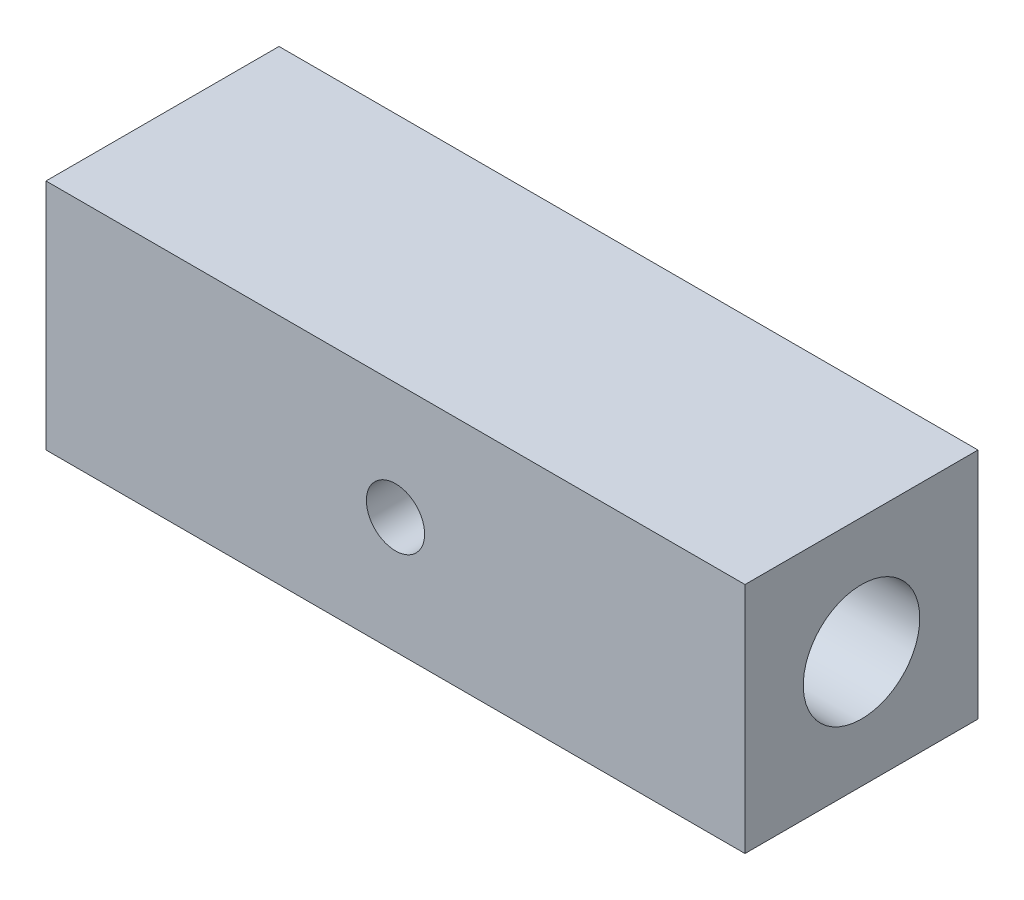
ISO-10303-21;
HEADER;
FILE_DESCRIPTION(('STEP AP214'),'2;1');
FILE_NAME('part.step','',(''),(''),'','','');
FILE_SCHEMA(('AUTOMOTIVE_DESIGN { 1 0 10303 214 1 1 1 1 }'));
ENDSEC;
DATA;
#1=APPLICATION_CONTEXT('core data for automotive mechanical design processes');
#2=APPLICATION_PROTOCOL_DEFINITION('international standard','automotive_design',2000,#1);
#3=PRODUCT_CONTEXT('',#1,'mechanical');
#4=PRODUCT('Part','Part','',(#3));
#5=PRODUCT_RELATED_PRODUCT_CATEGORY('part','',(#4));
#6=PRODUCT_DEFINITION_FORMATION('','',#4);
#7=PRODUCT_DEFINITION_CONTEXT('part definition',#1,'design');
#8=PRODUCT_DEFINITION('design','',#6,#7);
#9=PRODUCT_DEFINITION_SHAPE('','',#8);
#10=(LENGTH_UNIT() NAMED_UNIT(*) SI_UNIT(.MILLI.,.METRE.));
#11=(NAMED_UNIT(*) PLANE_ANGLE_UNIT() SI_UNIT($,.RADIAN.));
#12=(NAMED_UNIT(*) SI_UNIT($,.STERADIAN.) SOLID_ANGLE_UNIT());
#13=UNCERTAINTY_MEASURE_WITH_UNIT(LENGTH_MEASURE(1.E-05),#10,'distance_accuracy_value','');
#14=(GEOMETRIC_REPRESENTATION_CONTEXT(3) GLOBAL_UNCERTAINTY_ASSIGNED_CONTEXT((#13)) GLOBAL_UNIT_ASSIGNED_CONTEXT((#10,
#11,#12)) REPRESENTATION_CONTEXT('',''));
#15=CARTESIAN_POINT('',(0.,0.,0.));
#16=DIRECTION('',(0.,0.,1.));
#17=DIRECTION('',(1.,0.,0.));
#18=AXIS2_PLACEMENT_3D('',#15,#16,#17);
#19=CARTESIAN_POINT('',(-38.1000002396493,12.7000000000205,25.4634999977869));
#20=DIRECTION('',(0.,0.,-1.));
#21=DIRECTION('',(-1.,0.,0.));
#22=AXIS2_PLACEMENT_3D('',#19,#20,#21);
#23=CYLINDRICAL_SURFACE('',#22,3.190875);
#24=CARTESIAN_POINT('',(-41.2908752396493,12.7000000000205,19.0817499977869));
#25=CARTESIAN_POINT('',(-41.2908743474931,12.6160855933507,19.0817493060097));
#26=CARTESIAN_POINT('',(-41.2875588658311,12.5321623311625,19.0800893248495));
#27=CARTESIAN_POINT('',(-41.2743471357267,12.3649547781104,19.0735000112951));
#28=CARTESIAN_POINT('',(-41.2644480244409,12.2816707811699,19.0685692566314));
#29=CARTESIAN_POINT('',(-41.2249753142781,12.0335020592202,19.0490113866076));
#30=CARTESIAN_POINT('',(-41.1856265368609,11.8704226025251,19.0296189121461));
#31=CARTESIAN_POINT('',(-41.0828495747987,11.5546504545712,18.9801628203011));
#32=CARTESIAN_POINT('',(-41.0195149693097,11.4019200828612,18.9501407030445));
#33=CARTESIAN_POINT('',(-40.8710504856523,11.1094464478898,18.8821852588054));
#34=CARTESIAN_POINT('',(-40.7859223259476,10.9697021618341,18.8442525556315));
#35=CARTESIAN_POINT('',(-40.5904207617664,10.6976972060963,18.7612665144259));
#36=CARTESIAN_POINT('',(-40.4788316439664,10.5664007393246,18.7159212268586));
#37=CARTESIAN_POINT('',(-40.2362315726586,10.3235059558684,18.624178880477));
#38=CARTESIAN_POINT('',(-40.105205957734,10.2119226497272,18.5777810502808));
#39=CARTESIAN_POINT('',(-39.8151121871572,10.0028930726167,18.4850175288783));
#40=CARTESIAN_POINT('',(-39.6546573206912,9.90721419164304,18.4389333668636));
#41=CARTESIAN_POINT('',(-39.401929512539,9.78530553300755,18.3774435786149));
#42=CARTESIAN_POINT('',(-39.3156481775115,9.74826207554571,18.3582145268865));
#43=CARTESIAN_POINT('',(-39.1395866978743,9.68175878718743,18.3230212765622));
#44=CARTESIAN_POINT('',(-39.0498086564779,9.65229447625028,18.3070551504004));
#45=CARTESIAN_POINT('',(-38.8728346349247,9.602848653926,18.2798867447191));
#46=CARTESIAN_POINT('',(-38.7858013916506,9.58240831249509,18.2684580606213));
#47=CARTESIAN_POINT('',(-38.6099500242599,9.54886671639478,18.2495462293957));
#48=CARTESIAN_POINT('',(-38.5211328731087,9.53576156788603,18.2420609890408));
#49=CARTESIAN_POINT('',(-38.3424999671064,9.5170874838334,18.2313579494052));
#50=CARTESIAN_POINT('',(-38.252684846572,9.51151400964399,18.2281375801035));
#51=CARTESIAN_POINT('',(-38.0728845515503,9.50797147301019,18.2260908711929));
#52=CARTESIAN_POINT('',(-37.9828993941066,9.51000168503876,18.2272641123555));
#53=CARTESIAN_POINT('',(-37.7354386245463,9.52609010020135,18.2365368609324));
#54=CARTESIAN_POINT('',(-37.5785643011869,9.54810640281817,18.2492166142319));
#55=CARTESIAN_POINT('',(-37.2712303651362,9.61461234898019,18.2864582529678));
#56=CARTESIAN_POINT('',(-37.1207728123814,9.6591091512827,18.3110239232856));
#57=CARTESIAN_POINT('',(-36.8261182216023,9.77010832619232,18.3697867461296));
#58=CARTESIAN_POINT('',(-36.682148641663,9.83709913081982,18.404194915742));
#59=CARTESIAN_POINT('',(-36.4068103230444,9.99081384668363,18.4787828493036));
#60=CARTESIAN_POINT('',(-36.2754472821428,10.0775466215404,18.5189652027113));
#61=CARTESIAN_POINT('',(-36.0115054440278,10.2811060593123,18.606729602424));
#62=CARTESIAN_POINT('',(-35.8808844778685,10.4003540922512,18.6546038767465));
#63=CARTESIAN_POINT('',(-35.6406796710711,10.6592580706138,18.7482276885647));
#64=CARTESIAN_POINT('',(-35.5311058843588,10.7989237134068,18.7939762027454));
#65=CARTESIAN_POINT('',(-35.331323810331,11.102914400797,18.8807882942936));
#66=CARTESIAN_POINT('',(-35.2422510966415,11.2680833851143,18.9215356612814));
#67=CARTESIAN_POINT('',(-35.0938863676058,11.6136148629854,18.9910615344014));
#68=CARTESIAN_POINT('',(-35.0345707053119,11.7939651589212,19.0198495411053));
#69=CARTESIAN_POINT('',(-34.9522805392333,12.1487237213405,19.060190332675));
#70=CARTESIAN_POINT('',(-34.926703018699,12.3223869688383,19.072973122973));
#71=CARTESIAN_POINT('',(-34.9044514647777,12.6719853939259,19.084079765836));
#72=CARTESIAN_POINT('',(-34.9077637388743,12.8479194557708,19.08241046807));
#73=CARTESIAN_POINT('',(-34.9416935067744,13.1825655095312,19.0655145786413));
#74=CARTESIAN_POINT('',(-34.9701747600815,13.3415554386875,19.0513487986442));
#75=CARTESIAN_POINT('',(-35.0502833972502,13.6521790924887,19.0122582067243));
#76=CARTESIAN_POINT('',(-35.101913332869,13.8038120041022,18.9873322086777));
#77=CARTESIAN_POINT('',(-35.2282078462418,14.1004386885047,18.9280854800621));
#78=CARTESIAN_POINT('',(-35.3034888316811,14.2451186680511,18.8935165088746));
#79=CARTESIAN_POINT('',(-35.4742532474636,14.5202708975479,18.8183105383668));
#80=CARTESIAN_POINT('',(-35.5697452839216,14.6507370591177,18.7776709562814));
#81=CARTESIAN_POINT('',(-35.7890422867749,14.9073442255144,18.6895347050218));
#82=CARTESIAN_POINT('',(-35.9147067397964,15.0318023535744,18.6417565682604));
#83=CARTESIAN_POINT('',(-36.1852364065748,15.2586232883051,18.5476738347622));
#84=CARTESIAN_POINT('',(-36.3301147917921,15.3609708101197,18.5013702761206));
#85=CARTESIAN_POINT('',(-36.6438241846174,15.5453284919315,18.4132997274388));
#86=CARTESIAN_POINT('',(-36.8134753880072,15.6261137297505,18.3718610262772));
#87=CARTESIAN_POINT('',(-37.1667014268634,15.7571225364075,18.302349177137));
#88=CARTESIAN_POINT('',(-37.3502579764859,15.8073854842173,18.2742588177406));
#89=CARTESIAN_POINT('',(-37.7072361459018,15.8712884147015,18.2381305432187));
#90=CARTESIAN_POINT('',(-37.8799391588086,15.8879808744831,18.2284265308365));
#91=CARTESIAN_POINT('',(-38.225870904357,15.8930739959374,18.2254900092978));
#92=CARTESIAN_POINT('',(-38.3990993765997,15.8814869208427,18.2322503604765));
#93=CARTESIAN_POINT('',(-38.7237636432386,15.8332035581607,18.2597123731386));
#94=CARTESIAN_POINT('',(-38.8757034010891,15.7990044446577,18.2790245697034));
#95=CARTESIAN_POINT('',(-39.1715220239673,15.70955455655,18.3277786797279));
#96=CARTESIAN_POINT('',(-39.3153982789139,15.6542970101558,18.3572238513666));
#97=CARTESIAN_POINT('',(-39.601705107575,15.5201460214552,18.4253400399755));
#98=CARTESIAN_POINT('',(-39.7433891130618,15.439914018085,18.4644979870663));
#99=CARTESIAN_POINT('',(-40.012211158531,15.2595617295441,18.5468106789648));
#100=CARTESIAN_POINT('',(-40.1393415763917,15.1594310973283,18.5899674968792));
#101=CARTESIAN_POINT('',(-40.3914982514472,14.9278868910157,18.681687173087));
#102=CARTESIAN_POINT('',(-40.5143918948442,14.7941505450355,18.7302697385542));
#103=CARTESIAN_POINT('',(-40.7365151022486,14.5065002145292,18.8225840708332));
#104=CARTESIAN_POINT('',(-40.8357319109619,14.3525754228676,18.8663132162335));
#105=CARTESIAN_POINT('',(-40.9645319071774,14.1087960928506,18.9248802833488));
#106=CARTESIAN_POINT('',(-41.0042498262491,14.0250141103312,18.9432928891643));
#107=CARTESIAN_POINT('',(-41.0764077118471,13.8538173952883,18.9771834007167));
#108=CARTESIAN_POINT('',(-41.1088512542163,13.7664044727728,18.9926627477646));
#109=CARTESIAN_POINT('',(-41.1660133822939,13.5887831294476,19.0201947237623));
#110=CARTESIAN_POINT('',(-41.1907488163781,13.4985812862159,19.0322548212222));
#111=CARTESIAN_POINT('',(-41.2322509661268,13.31599028992,19.0526148826845));
#112=CARTESIAN_POINT('',(-41.2490225495038,13.2236025093092,19.0609171434289));
#113=CARTESIAN_POINT('',(-41.271394605936,13.0593190042825,19.0720266555834));
#114=CARTESIAN_POINT('',(-41.2786934550052,12.9877054167415,19.0756664394564));
#115=CARTESIAN_POINT('',(-41.2884342218196,12.8440634023065,19.0805284408449));
#116=CARTESIAN_POINT('',(-41.2908760055064,12.7720349640174,19.0817505916319));
#117=CARTESIAN_POINT('',(-41.2908752396493,12.7000000000205,19.0817499977869));
#118=B_SPLINE_CURVE_WITH_KNOTS('',3,(#24,#25,#26,#27,#28,#29,#30,#31,#32,#33,#34,#35,#36,#37,
#38,#39,#40,#41,#42,#43,#44,#45,#46,#47,#48,#49,#50,#51,#52,#53,#54,#55,#56,#57,#58,#59,#60,#61,
#62,#63,#64,#65,#66,#67,#68,#69,#70,#71,#72,#73,#74,#75,#76,#77,#78,#79,#80,#81,#82,#83,#84,#85,
#86,#87,#88,#89,#90,#91,#92,#93,#94,#95,#96,#97,#98,#99,#100,#101,#102,#103,#104,#105,#106,#107,
#108,#109,#110,#111,#112,#113,#114,#115,#116,#117),.UNSPECIFIED.,.T.,.F.,(4,2,2,2,2,2,2,2,2,2,2,
2,2,2,2,2,2,2,2,2,2,2,2,2,2,2,2,2,2,2,2,2,2,2,2,2,2,2,2,2,2,2,2,2,2,2,4),(0.,0.251667690163192,
0.503444887798333,1.00736028760569,1.50932961580885,2.01125937494807,2.54355475475194,
3.07625371897668,3.65026349864964,3.93746226456018,4.22449087486513,4.49449336842552,
4.76435239665599,5.03404873311156,5.30371933639088,5.77802232661177,6.2524764505813,
6.73798200179402,7.2237059635799,7.7710182476052,8.31859132794363,8.89159231090284,
9.4641372247175,9.98926187064536,10.5141376436734,10.998331928795,11.4825796014088,
11.980673095598,12.4789791123839,13.0262192769592,13.5738365415424,14.1479736652377,
14.7213684713491,15.2397195915976,15.7578459722668,16.2266132826379,16.695531462535,
17.1959540910977,17.6966376174516,18.2581576406254,18.8199794889938,19.1032427163757,
19.3863663941547,19.6688668078388,19.9511943269528,20.1672284189608,20.3832684735777),.UNSPECIFIED.);
#119=CARTESIAN_POINT('',(-41.2908752396493,12.7000000000205,19.0817499977869));
#120=VERTEX_POINT('',#119);
#121=EDGE_CURVE('E39',#120,#120,#118,.T.);
#122=ORIENTED_EDGE('',*,*,#121,.F.);
#123=EDGE_LOOP('',(#122));
#124=FACE_BOUND('',#123,.T.);
#125=CARTESIAN_POINT('',(-38.1000002396493,12.7000000000205,25.4634999977869));
#126=DIRECTION('',(0.,0.,1.));
#127=DIRECTION('',(1.,0.,0.));
#128=AXIS2_PLACEMENT_3D('',#125,#126,#127);
#129=CIRCLE('',#128,3.190875);
#130=CARTESIAN_POINT('',(-34.9091252396493,12.7000000000205,25.4634999977869));
#131=VERTEX_POINT('',#130);
#132=EDGE_CURVE('E110',#131,#131,#129,.T.);
#133=ORIENTED_EDGE('',*,*,#132,.T.);
#134=EDGE_LOOP('',(#133));
#135=FACE_BOUND('',#134,.T.);
#136=ADVANCED_FACE('F35',(#124,#135),#23,.F.);
#137=CARTESIAN_POINT('',(0.190499760350716,-0.0634999999795309,25.4634999977869));
#138=DIRECTION('',(0.,0.,1.));
#139=DIRECTION('',(1.,0.,0.));
#140=AXIS2_PLACEMENT_3D('',#137,#138,#139);
#141=PLANE('',#140);
#142=DIRECTION('',(0.,-1.,0.));
#143=VECTOR('',#142,1.);
#144=CARTESIAN_POINT('',(-76.3905002396493,25.4635000000205,25.4634999977869));
#145=LINE('',#144,#143);
#146=CARTESIAN_POINT('',(-76.3905002396493,25.4635000000205,25.4634999977869));
#147=VERTEX_POINT('',#146);
#148=CARTESIAN_POINT('',(-76.3905002396493,-0.0634999999795309,25.4634999977869));
#149=VERTEX_POINT('',#148);
#150=EDGE_CURVE('E94',#147,#149,#145,.T.);
#151=ORIENTED_EDGE('',*,*,#150,.T.);
#152=DIRECTION('',(1.,0.,0.));
#153=VECTOR('',#152,1.);
#154=CARTESIAN_POINT('',(-76.3905002396493,-0.0634999999795309,25.4634999977869));
#155=LINE('',#154,#153);
#156=CARTESIAN_POINT('',(0.190499760350716,-0.0634999999795309,25.4634999977869));
#157=VERTEX_POINT('',#156);
#158=EDGE_CURVE('E88',#149,#157,#155,.T.);
#159=ORIENTED_EDGE('',*,*,#158,.T.);
#160=DIRECTION('',(0.,1.,0.));
#161=VECTOR('',#160,1.);
#162=CARTESIAN_POINT('',(0.190499760350716,25.4635000000205,25.4634999977869));
#163=LINE('',#162,#161);
#164=CARTESIAN_POINT('',(0.190499760350716,25.4635000000205,25.4634999977869));
#165=VERTEX_POINT('',#164);
#166=EDGE_CURVE('E92',#157,#165,#163,.T.);
#167=ORIENTED_EDGE('',*,*,#166,.T.);
#168=DIRECTION('',(-1.,0.,0.));
#169=VECTOR('',#168,1.);
#170=CARTESIAN_POINT('',(-76.3905002396493,25.4635000000205,25.4634999977869));
#171=LINE('',#170,#169);
#172=EDGE_CURVE('E58',#165,#147,#171,.T.);
#173=ORIENTED_EDGE('',*,*,#172,.T.);
#174=EDGE_LOOP('',(#151,#159,#167,#173));
#175=FACE_BOUND('',#174,.T.);
#176=ORIENTED_EDGE('',*,*,#132,.F.);
#177=EDGE_LOOP('',(#176));
#178=FACE_BOUND('',#177,.T.);
#179=ADVANCED_FACE('F89',(#175,#178),#141,.T.);
#180=CARTESIAN_POINT('',(0.190499760350716,-0.0634999999795309,-0.0635000022130899));
#181=DIRECTION('',(0.,0.,1.));
#182=DIRECTION('',(1.,0.,0.));
#183=AXIS2_PLACEMENT_3D('',#180,#181,#182);
#184=PLANE('',#183);
#185=DIRECTION('',(0.,-1.,0.));
#186=VECTOR('',#185,1.);
#187=CARTESIAN_POINT('',(-76.3905002396493,25.4635000000205,-0.0635000022130899));
#188=LINE('',#187,#186);
#189=CARTESIAN_POINT('',(-76.3905002396493,25.4635000000205,-0.0635000022130899));
#190=VERTEX_POINT('',#189);
#191=CARTESIAN_POINT('',(-76.3905002396493,-0.0634999999795309,-0.0635000022130899));
#192=VERTEX_POINT('',#191);
#193=EDGE_CURVE('E107',#190,#192,#188,.T.);
#194=ORIENTED_EDGE('',*,*,#193,.F.);
#195=DIRECTION('',(-1.,0.,0.));
#196=VECTOR('',#195,1.);
#197=CARTESIAN_POINT('',(-76.3905002396493,25.4635000000205,-0.0635000022130899));
#198=LINE('',#197,#196);
#199=CARTESIAN_POINT('',(0.190499760350716,25.4635000000205,-0.0635000022130899));
#200=VERTEX_POINT('',#199);
#201=EDGE_CURVE('E81',#200,#190,#198,.T.);
#202=ORIENTED_EDGE('',*,*,#201,.F.);
#203=DIRECTION('',(0.,1.,0.));
#204=VECTOR('',#203,1.);
#205=CARTESIAN_POINT('',(0.190499760350716,25.4635000000205,-0.0635000022130899));
#206=LINE('',#205,#204);
#207=CARTESIAN_POINT('',(0.190499760350716,-0.0634999999795309,-0.0635000022130899));
#208=VERTEX_POINT('',#207);
#209=EDGE_CURVE('E75',#208,#200,#206,.T.);
#210=ORIENTED_EDGE('',*,*,#209,.F.);
#211=DIRECTION('',(1.,0.,0.));
#212=VECTOR('',#211,1.);
#213=CARTESIAN_POINT('',(-76.3905002396493,-0.0634999999795309,-0.0635000022130899));
#214=LINE('',#213,#212);
#215=EDGE_CURVE('E98',#192,#208,#214,.T.);
#216=ORIENTED_EDGE('',*,*,#215,.F.);
#217=EDGE_LOOP('',(#194,#202,#210,#216));
#218=FACE_BOUND('',#217,.T.);
#219=CARTESIAN_POINT('',(-38.1000002396493,12.7000000000205,-0.0635000022130899));
#220=DIRECTION('',(0.,0.,1.));
#221=DIRECTION('',(1.,0.,0.));
#222=AXIS2_PLACEMENT_3D('',#219,#220,#221);
#223=CIRCLE('',#222,3.190875);
#224=CARTESIAN_POINT('',(-34.9091252396493,12.7000000000205,-0.0635000022130899));
#225=VERTEX_POINT('',#224);
#226=EDGE_CURVE('E145',#225,#225,#223,.T.);
#227=ORIENTED_EDGE('',*,*,#226,.T.);
#228=EDGE_LOOP('',(#227));
#229=FACE_BOUND('',#228,.T.);
#230=ADVANCED_FACE('F140',(#218,#229),#184,.F.);
#231=CARTESIAN_POINT('',(-76.3905002396493,25.4635000000205,25.4634999977869));
#232=DIRECTION('',(1.,0.,0.));
#233=DIRECTION('',(0.,1.,0.));
#234=AXIS2_PLACEMENT_3D('',#231,#232,#233);
#235=PLANE('',#234);
#236=CARTESIAN_POINT('',(-76.3905002396493,12.7000000000205,12.6999999977869));
#237=DIRECTION('',(1.,0.,0.));
#238=DIRECTION('',(0.,0.,-1.));
#239=AXIS2_PLACEMENT_3D('',#236,#237,#238);
#240=CIRCLE('',#239,6.38175);
#241=CARTESIAN_POINT('',(-76.3905002396493,12.7000000000205,6.31824999778691));
#242=VERTEX_POINT('',#241);
#243=EDGE_CURVE('E119',#242,#242,#240,.T.);
#244=ORIENTED_EDGE('',*,*,#243,.T.);
#245=EDGE_LOOP('',(#244));
#246=FACE_BOUND('',#245,.T.);
#247=ORIENTED_EDGE('',*,*,#193,.T.);
#248=DIRECTION('',(0.,0.,-1.));
#249=VECTOR('',#248,1.);
#250=CARTESIAN_POINT('',(-76.3905002396493,-0.0634999999795309,25.4634999977869));
#251=LINE('',#250,#249);
#252=EDGE_CURVE('E11',#149,#192,#251,.T.);
#253=ORIENTED_EDGE('',*,*,#252,.F.);
#254=ORIENTED_EDGE('',*,*,#150,.F.);
#255=DIRECTION('',(0.,0.,-1.));
#256=VECTOR('',#255,1.);
#257=CARTESIAN_POINT('',(-76.3905002396493,25.4635000000205,25.4634999977869));
#258=LINE('',#257,#256);
#259=EDGE_CURVE('E103',#147,#190,#258,.T.);
#260=ORIENTED_EDGE('',*,*,#259,.T.);
#261=EDGE_LOOP('',(#247,#253,#254,#260));
#262=FACE_BOUND('',#261,.T.);
#263=ADVANCED_FACE('F37',(#246,#262),#235,.F.);
#264=CARTESIAN_POINT('',(-76.3905002396493,-0.0634999999795309,25.4634999977869));
#265=DIRECTION('',(0.,1.,0.));
#266=DIRECTION('',(0.,0.,1.));
#267=AXIS2_PLACEMENT_3D('',#264,#265,#266);
#268=PLANE('',#267);
#269=ORIENTED_EDGE('',*,*,#215,.T.);
#270=DIRECTION('',(0.,0.,-1.));
#271=VECTOR('',#270,1.);
#272=CARTESIAN_POINT('',(0.190499760350716,-0.0634999999795309,25.4634999977869));
#273=LINE('',#272,#271);
#274=EDGE_CURVE('E49',#157,#208,#273,.T.);
#275=ORIENTED_EDGE('',*,*,#274,.F.);
#276=ORIENTED_EDGE('',*,*,#158,.F.);
#277=ORIENTED_EDGE('',*,*,#252,.T.);
#278=EDGE_LOOP('',(#269,#275,#276,#277));
#279=FACE_BOUND('',#278,.T.);
#280=ADVANCED_FACE('F97',(#279),#268,.F.);
#281=CARTESIAN_POINT('',(0.190499760350716,25.4635000000205,25.4634999977869));
#282=DIRECTION('',(-1.,0.,0.));
#283=DIRECTION('',(0.,0.,1.));
#284=AXIS2_PLACEMENT_3D('',#281,#282,#283);
#285=PLANE('',#284);
#286=CARTESIAN_POINT('',(0.190499760350716,12.7000000000205,12.6999999977869));
#287=DIRECTION('',(1.,0.,0.));
#288=DIRECTION('',(0.,0.,-1.));
#289=AXIS2_PLACEMENT_3D('',#286,#287,#288);
#290=CIRCLE('',#289,6.38175);
#291=CARTESIAN_POINT('',(0.190499760350716,12.7000000000205,6.31824999778691));
#292=VERTEX_POINT('',#291);
#293=EDGE_CURVE('E150',#292,#292,#290,.T.);
#294=ORIENTED_EDGE('',*,*,#293,.F.);
#295=EDGE_LOOP('',(#294));
#296=FACE_BOUND('',#295,.T.);
#297=ORIENTED_EDGE('',*,*,#209,.T.);
#298=DIRECTION('',(0.,0.,-1.));
#299=VECTOR('',#298,1.);
#300=CARTESIAN_POINT('',(0.190499760350716,25.4635000000205,25.4634999977869));
#301=LINE('',#300,#299);
#302=EDGE_CURVE('E99',#165,#200,#301,.T.);
#303=ORIENTED_EDGE('',*,*,#302,.F.);
#304=ORIENTED_EDGE('',*,*,#166,.F.);
#305=ORIENTED_EDGE('',*,*,#274,.T.);
#306=EDGE_LOOP('',(#297,#303,#304,#305));
#307=FACE_BOUND('',#306,.T.);
#308=ADVANCED_FACE('F101',(#296,#307),#285,.F.);
#309=CARTESIAN_POINT('',(-76.3905002396493,25.4635000000205,25.4634999977869));
#310=DIRECTION('',(0.,-1.,0.));
#311=DIRECTION('',(0.,0.,-1.));
#312=AXIS2_PLACEMENT_3D('',#309,#310,#311);
#313=PLANE('',#312);
#314=ORIENTED_EDGE('',*,*,#201,.T.);
#315=ORIENTED_EDGE('',*,*,#259,.F.);
#316=ORIENTED_EDGE('',*,*,#172,.F.);
#317=ORIENTED_EDGE('',*,*,#302,.T.);
#318=EDGE_LOOP('',(#314,#315,#316,#317));
#319=FACE_BOUND('',#318,.T.);
#320=ADVANCED_FACE('F131',(#319),#313,.F.);
#321=CARTESIAN_POINT('',(-41.2908752396493,12.7000000000205,6.31824999778691));
#322=CARTESIAN_POINT('',(-41.2908743474931,12.7839144066903,6.31825068956415));
#323=CARTESIAN_POINT('',(-41.2875588658311,12.8678376688784,6.31991067072431));
#324=CARTESIAN_POINT('',(-41.2743471357267,13.0350452219305,6.32649998427868));
#325=CARTESIAN_POINT('',(-41.2644480244409,13.118329218871,6.33143073894242));
#326=CARTESIAN_POINT('',(-41.2249753142781,13.3664979408207,6.35098860896624));
#327=CARTESIAN_POINT('',(-41.1856265368609,13.5295773975158,6.37038108342769));
#328=CARTESIAN_POINT('',(-41.0828495747987,13.8453495454697,6.41983717527272));
#329=CARTESIAN_POINT('',(-41.0195149693097,13.9980799171797,6.44985929252932));
#330=CARTESIAN_POINT('',(-40.8710504856523,14.2905535521512,6.51781473676846));
#331=CARTESIAN_POINT('',(-40.7859223259476,14.4302978382068,6.55574743994234));
#332=CARTESIAN_POINT('',(-40.5904207617664,14.7023027939446,6.63873348114794));
#333=CARTESIAN_POINT('',(-40.4788316439664,14.8335992607164,6.68407876871519));
#334=CARTESIAN_POINT('',(-40.2362315726586,15.0764940441725,6.7758211150968));
#335=CARTESIAN_POINT('',(-40.105205957734,15.1880773503137,6.82221894529302));
#336=CARTESIAN_POINT('',(-39.8151121871572,15.3971069274242,6.91498246669554));
#337=CARTESIAN_POINT('',(-39.6546573206912,15.4927858083979,6.96106662871019));
#338=CARTESIAN_POINT('',(-39.401929512539,15.6146944670334,7.02255641695896));
#339=CARTESIAN_POINT('',(-39.3156481775115,15.6517379244952,7.04178546868729));
#340=CARTESIAN_POINT('',(-39.1395866978743,15.7182412128535,7.07697871901157));
#341=CARTESIAN_POINT('',(-39.0498086564779,15.7477055237907,7.09294484517345));
#342=CARTESIAN_POINT('',(-38.8728346349247,15.7971513461149,7.12011325085467));
#343=CARTESIAN_POINT('',(-38.7858013916506,15.8175916875458,7.13154193495256));
#344=CARTESIAN_POINT('',(-38.6099500242599,15.8511332836462,7.15045376617815));
#345=CARTESIAN_POINT('',(-38.5211328731087,15.8642384321549,7.157939006533));
#346=CARTESIAN_POINT('',(-38.3424999671064,15.8829125162075,7.16864204616858));
#347=CARTESIAN_POINT('',(-38.252684846572,15.8884859903969,7.17186241547037));
#348=CARTESIAN_POINT('',(-38.0728845515503,15.8920285270307,7.17390912438089));
#349=CARTESIAN_POINT('',(-37.9828993941066,15.8899983150022,7.17273588321828));
#350=CARTESIAN_POINT('',(-37.7354386245463,15.8739098998396,7.16346313464144));
#351=CARTESIAN_POINT('',(-37.5785643011869,15.8518935972228,7.15078338134195));
#352=CARTESIAN_POINT('',(-37.2712303651362,15.7853876510608,7.11354174260603));
#353=CARTESIAN_POINT('',(-37.1207728123814,15.7408908487582,7.08897607228824));
#354=CARTESIAN_POINT('',(-36.8261182216023,15.6298916738486,7.03021324944418));
#355=CARTESIAN_POINT('',(-36.682148641663,15.5629008692211,6.99580507983181));
#356=CARTESIAN_POINT('',(-36.4068103230444,15.4091861533573,6.9212171462702));
#357=CARTESIAN_POINT('',(-36.2754472821427,15.3224533785005,6.88103479286248));
#358=CARTESIAN_POINT('',(-36.0115054440278,15.1188939407286,6.79327039314987));
#359=CARTESIAN_POINT('',(-35.8808844778685,14.9996459077898,6.74539611882736));
#360=CARTESIAN_POINT('',(-35.6406796710711,14.7407419294272,6.65177230700912));
#361=CARTESIAN_POINT('',(-35.5311058843588,14.6010762866341,6.60602379282842));
#362=CARTESIAN_POINT('',(-35.331323810331,14.2970855992439,6.51921170128023));
#363=CARTESIAN_POINT('',(-35.2422510966415,14.1319166149266,6.47846433429246));
#364=CARTESIAN_POINT('',(-35.0938863676058,13.7863851370556,6.40893846117239));
#365=CARTESIAN_POINT('',(-35.0345707053119,13.6060348411197,6.38015045446851));
#366=CARTESIAN_POINT('',(-34.9522805392333,13.2512762787004,6.33980966289882));
#367=CARTESIAN_POINT('',(-34.926703018699,13.0776130312026,6.32702687260081));
#368=CARTESIAN_POINT('',(-34.9044514647777,12.728014606115,6.31592022973784));
#369=CARTESIAN_POINT('',(-34.9077637388743,12.5520805442702,6.31758952750381));
#370=CARTESIAN_POINT('',(-34.9416935067744,12.2174344905097,6.3344854169325));
#371=CARTESIAN_POINT('',(-34.9701747600815,12.0584445613535,6.34865119692958));
#372=CARTESIAN_POINT('',(-35.0502833972502,11.7478209075522,6.38774178884949));
#373=CARTESIAN_POINT('',(-35.101913332869,11.5961879959387,6.41266778689608));
#374=CARTESIAN_POINT('',(-35.2282078462418,11.2995613115362,6.47191451551176));
#375=CARTESIAN_POINT('',(-35.3034888316811,11.1548813319899,6.5064834866992));
#376=CARTESIAN_POINT('',(-35.4742532474636,10.879729102493,6.58168945720698));
#377=CARTESIAN_POINT('',(-35.5697452839216,10.7492629409232,6.62232903929237));
#378=CARTESIAN_POINT('',(-35.7890422867749,10.4926557745265,6.71046529055203));
#379=CARTESIAN_POINT('',(-35.9147067397964,10.3681976464666,6.75824342731338));
#380=CARTESIAN_POINT('',(-36.1852364065748,10.1413767117358,6.85232616081166));
#381=CARTESIAN_POINT('',(-36.3301147917921,10.0390291899212,6.89862971945326));
#382=CARTESIAN_POINT('',(-36.6438241846174,9.85467150810948,6.98670026813506));
#383=CARTESIAN_POINT('',(-36.8134753880072,9.77388627029043,7.02813896929661));
#384=CARTESIAN_POINT('',(-37.1667014268634,9.64287746363344,7.09765081843684));
#385=CARTESIAN_POINT('',(-37.3502579764859,9.59261451582367,7.12574117783318));
#386=CARTESIAN_POINT('',(-37.7072361459018,9.5287115853394,7.16186945235515));
#387=CARTESIAN_POINT('',(-37.8799391588085,9.51201912555788,7.1715734647373));
#388=CARTESIAN_POINT('',(-38.225870904357,9.50692600410352,7.17450998627606));
#389=CARTESIAN_POINT('',(-38.3990993765996,9.5185130791982,7.16774963509728));
#390=CARTESIAN_POINT('',(-38.7237636432386,9.56679644188021,7.14028762243518));
#391=CARTESIAN_POINT('',(-38.8757034010891,9.60099555538322,7.1209754258704));
#392=CARTESIAN_POINT('',(-39.1715220239673,9.69044544349096,7.07222131584597));
#393=CARTESIAN_POINT('',(-39.3153982789139,9.74570298988518,7.0427761442072));
#394=CARTESIAN_POINT('',(-39.601705107575,9.8798539785857,6.97465995559831));
#395=CARTESIAN_POINT('',(-39.7433891130618,9.96008598195598,6.93550200850756));
#396=CARTESIAN_POINT('',(-40.012211158531,10.1404382704968,6.85318931660897));
#397=CARTESIAN_POINT('',(-40.1393415763917,10.2405689027127,6.8100324986946));
#398=CARTESIAN_POINT('',(-40.3914982514472,10.4721131090252,6.71831282248682));
#399=CARTESIAN_POINT('',(-40.5143918948442,10.6058494550054,6.66973025701958));
#400=CARTESIAN_POINT('',(-40.7365151022486,10.8934997855118,6.57741592474057));
#401=CARTESIAN_POINT('',(-40.8357319109619,11.0474245771733,6.53368677934033));
#402=CARTESIAN_POINT('',(-40.9645319071774,11.2912039071904,6.47511971222497));
#403=CARTESIAN_POINT('',(-41.0042498262491,11.3749858897097,6.45670710640951));
#404=CARTESIAN_POINT('',(-41.0764077118471,11.5461826047527,6.4228165948571));
#405=CARTESIAN_POINT('',(-41.1088512542163,11.6335955272681,6.40733724780924));
#406=CARTESIAN_POINT('',(-41.1660133822939,11.8112168705933,6.3798052718115));
#407=CARTESIAN_POINT('',(-41.1907488163781,11.901418713825,6.36774517435166));
#408=CARTESIAN_POINT('',(-41.2322509661268,12.0840097101209,6.34738511288929));
#409=CARTESIAN_POINT('',(-41.2490225495038,12.1763974907318,6.33908285214489));
#410=CARTESIAN_POINT('',(-41.271394605936,12.3406809957585,6.3279733399904));
#411=CARTESIAN_POINT('',(-41.2786934550052,12.4122945832994,6.32433355611738));
#412=CARTESIAN_POINT('',(-41.2884342218196,12.5559365977344,6.31947155472896));
#413=CARTESIAN_POINT('',(-41.2908760055064,12.6279650360236,6.31824940394194));
#414=CARTESIAN_POINT('',(-41.2908752396493,12.7000000000205,6.31824999778691));
#415=B_SPLINE_CURVE_WITH_KNOTS('',3,(#321,#322,#323,#324,#325,#326,#327,#328,#329,#330,#331,
#332,#333,#334,#335,#336,#337,#338,#339,#340,#341,#342,#343,#344,#345,#346,#347,#348,#349,#350,
#351,#352,#353,#354,#355,#356,#357,#358,#359,#360,#361,#362,#363,#364,#365,#366,#367,#368,#369,
#370,#371,#372,#373,#374,#375,#376,#377,#378,#379,#380,#381,#382,#383,#384,#385,#386,#387,#388,
#389,#390,#391,#392,#393,#394,#395,#396,#397,#398,#399,#400,#401,#402,#403,#404,#405,#406,#407,
#408,#409,#410,#411,#412,#413,#414),.UNSPECIFIED.,.T.,.F.,(4,2,2,2,2,2,2,2,2,2,2,2,2,2,2,2,2,2,
2,2,2,2,2,2,2,2,2,2,2,2,2,2,2,2,2,2,2,2,2,2,2,2,2,2,2,2,4),(0.,0.251667690163192,
0.503444887798333,1.00736028760569,1.50932961580884,2.01125937494807,2.54355475475194,
3.07625371897668,3.65026349864964,3.93746226456018,4.22449087486513,4.49449336842552,
4.76435239665599,5.03404873311156,5.30371933639088,5.77802232661177,6.2524764505813,
6.73798200179402,7.22370596357991,7.7710182476052,8.31859132794363,8.89159231090283,
9.4641372247175,9.98926187064535,10.5141376436734,10.998331928795,11.4825796014088,
11.980673095598,12.4789791123839,13.0262192769592,13.5738365415424,14.1479736652377,
14.7213684713491,15.2397195915976,15.7578459722668,16.2266132826379,16.695531462535,
17.1959540910977,17.6966376174516,18.2581576406254,18.8199794889938,19.1032427163757,
19.3863663941547,19.6688668078387,19.9511943269528,20.1672284189608,20.3832684735777),.UNSPECIFIED.);
#416=CARTESIAN_POINT('',(-41.2908752396493,12.7000000000205,6.31824999778691));
#417=VERTEX_POINT('',#416);
#418=EDGE_CURVE('E115',#417,#417,#415,.T.);
#419=ORIENTED_EDGE('',*,*,#418,.F.);
#420=EDGE_LOOP('',(#419));
#421=FACE_BOUND('',#420,.T.);
#422=ORIENTED_EDGE('',*,*,#226,.F.);
#423=EDGE_LOOP('',(#422));
#424=FACE_BOUND('',#423,.T.);
#425=ADVANCED_FACE('F120',(#421,#424),#23,.F.);
#426=CARTESIAN_POINT('',(-76.3905002396493,12.7000000000205,12.6999999977869));
#427=DIRECTION('',(1.,0.,0.));
#428=DIRECTION('',(0.,0.,-1.));
#429=AXIS2_PLACEMENT_3D('',#426,#427,#428);
#430=CYLINDRICAL_SURFACE('',#429,6.38175);
#431=ORIENTED_EDGE('',*,*,#121,.T.);
#432=EDGE_LOOP('',(#431));
#433=FACE_BOUND('',#432,.T.);
#434=ORIENTED_EDGE('',*,*,#418,.T.);
#435=EDGE_LOOP('',(#434));
#436=FACE_BOUND('',#435,.T.);
#437=ORIENTED_EDGE('',*,*,#243,.F.);
#438=EDGE_LOOP('',(#437));
#439=FACE_BOUND('',#438,.T.);
#440=ORIENTED_EDGE('',*,*,#293,.T.);
#441=EDGE_LOOP('',(#440));
#442=FACE_BOUND('',#441,.T.);
#443=ADVANCED_FACE('F123',(#433,#436,#439,#442),#430,.F.);
#444=CLOSED_SHELL('',(#136,#179,#230,#263,#280,#308,#320,#425,#443));
#445=MANIFOLD_SOLID_BREP('B2',#444);
#446=ADVANCED_BREP_SHAPE_REPRESENTATION('',(#18,#445),#14);
#447=SHAPE_DEFINITION_REPRESENTATION(#9,#446);
ENDSEC;
END-ISO-10303-21;
